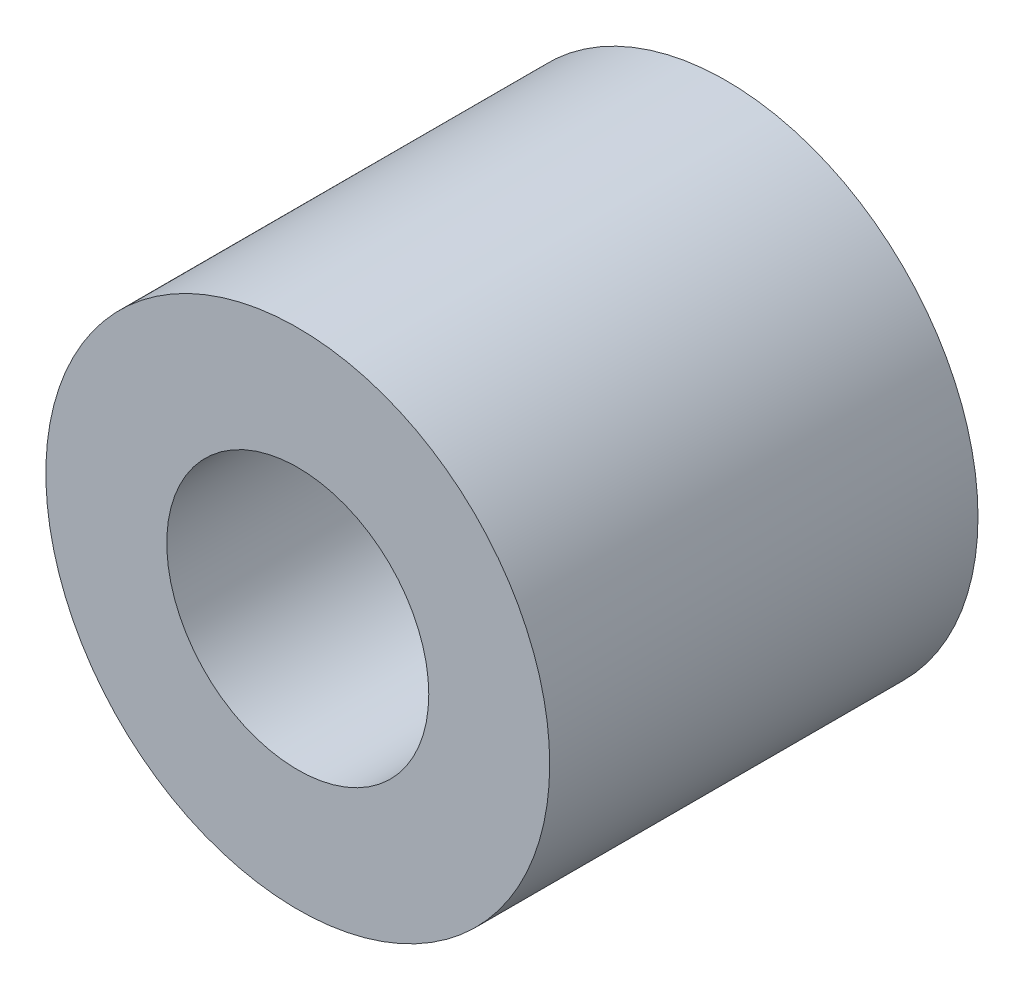
ISO-10303-21;
HEADER;
FILE_DESCRIPTION(('STEP AP214'),'2;1');
FILE_NAME('part.step','',(''),(''),'','','');
FILE_SCHEMA(('AUTOMOTIVE_DESIGN { 1 0 10303 214 1 1 1 1 }'));
ENDSEC;
DATA;
#1=APPLICATION_CONTEXT('core data for automotive mechanical design processes');
#2=APPLICATION_PROTOCOL_DEFINITION('international standard','automotive_design',2000,#1);
#3=PRODUCT_CONTEXT('',#1,'mechanical');
#4=PRODUCT('Part','Part','',(#3));
#5=PRODUCT_RELATED_PRODUCT_CATEGORY('part','',(#4));
#6=PRODUCT_DEFINITION_FORMATION('','',#4);
#7=PRODUCT_DEFINITION_CONTEXT('part definition',#1,'design');
#8=PRODUCT_DEFINITION('design','',#6,#7);
#9=PRODUCT_DEFINITION_SHAPE('','',#8);
#10=(LENGTH_UNIT() NAMED_UNIT(*) SI_UNIT(.MILLI.,.METRE.));
#11=(NAMED_UNIT(*) PLANE_ANGLE_UNIT() SI_UNIT($,.RADIAN.));
#12=(NAMED_UNIT(*) SI_UNIT($,.STERADIAN.) SOLID_ANGLE_UNIT());
#13=UNCERTAINTY_MEASURE_WITH_UNIT(LENGTH_MEASURE(1.E-05),#10,'distance_accuracy_value','');
#14=(GEOMETRIC_REPRESENTATION_CONTEXT(3) GLOBAL_UNCERTAINTY_ASSIGNED_CONTEXT((#13)) GLOBAL_UNIT_ASSIGNED_CONTEXT((#10,
#11,#12)) REPRESENTATION_CONTEXT('',''));
#15=CARTESIAN_POINT('',(0.,0.,0.));
#16=DIRECTION('',(0.,0.,1.));
#17=DIRECTION('',(1.,0.,0.));
#18=AXIS2_PLACEMENT_3D('',#15,#16,#17);
#19=CARTESIAN_POINT('',(0.,0.,8.5));
#20=DIRECTION('',(0.,0.,1.));
#21=DIRECTION('',(1.,0.,0.));
#22=AXIS2_PLACEMENT_3D('',#19,#20,#21);
#23=PLANE('',#22);
#24=CARTESIAN_POINT('',(0.,0.,8.5));
#25=DIRECTION('',(0.,0.,1.));
#26=DIRECTION('',(1.,0.,0.));
#27=AXIS2_PLACEMENT_3D('',#24,#25,#26);
#28=CIRCLE('',#27,5.);
#29=CARTESIAN_POINT('',(5.,0.,8.5));
#30=VERTEX_POINT('',#29);
#31=EDGE_CURVE('E10',#30,#30,#28,.T.);
#32=ORIENTED_EDGE('',*,*,#31,.T.);
#33=EDGE_LOOP('',(#32));
#34=FACE_BOUND('',#33,.T.);
#35=CARTESIAN_POINT('',(0.,0.,8.5));
#36=DIRECTION('',(0.,0.,1.));
#37=DIRECTION('',(1.,0.,0.));
#38=AXIS2_PLACEMENT_3D('',#35,#36,#37);
#39=CIRCLE('',#38,2.6);
#40=CARTESIAN_POINT('',(2.6,0.,8.5));
#41=VERTEX_POINT('',#40);
#42=EDGE_CURVE('E44',#41,#41,#39,.T.);
#43=ORIENTED_EDGE('',*,*,#42,.F.);
#44=EDGE_LOOP('',(#43));
#45=FACE_BOUND('',#44,.T.);
#46=ADVANCED_FACE('F33',(#34,#45),#23,.T.);
#47=CARTESIAN_POINT('',(0.,0.,0.));
#48=DIRECTION('',(0.,0.,1.));
#49=DIRECTION('',(1.,0.,0.));
#50=AXIS2_PLACEMENT_3D('',#47,#48,#49);
#51=PLANE('',#50);
#52=CARTESIAN_POINT('',(0.,0.,0.));
#53=DIRECTION('',(0.,0.,1.));
#54=DIRECTION('',(1.,0.,0.));
#55=AXIS2_PLACEMENT_3D('',#52,#53,#54);
#56=CIRCLE('',#55,5.);
#57=CARTESIAN_POINT('',(5.,0.,0.));
#58=VERTEX_POINT('',#57);
#59=EDGE_CURVE('E37',#58,#58,#56,.T.);
#60=ORIENTED_EDGE('',*,*,#59,.F.);
#61=EDGE_LOOP('',(#60));
#62=FACE_BOUND('',#61,.T.);
#63=CARTESIAN_POINT('',(0.,0.,0.));
#64=DIRECTION('',(0.,0.,1.));
#65=DIRECTION('',(1.,0.,0.));
#66=AXIS2_PLACEMENT_3D('',#63,#64,#65);
#67=CIRCLE('',#66,2.6);
#68=CARTESIAN_POINT('',(2.6,0.,0.));
#69=VERTEX_POINT('',#68);
#70=EDGE_CURVE('E46',#69,#69,#67,.T.);
#71=ORIENTED_EDGE('',*,*,#70,.T.);
#72=EDGE_LOOP('',(#71));
#73=FACE_BOUND('',#72,.T.);
#74=ADVANCED_FACE('F56',(#62,#73),#51,.F.);
#75=CARTESIAN_POINT('',(0.,0.,8.5));
#76=DIRECTION('',(0.,0.,-1.));
#77=DIRECTION('',(-1.,0.,0.));
#78=AXIS2_PLACEMENT_3D('',#75,#76,#77);
#79=CYLINDRICAL_SURFACE('',#78,5.);
#80=ORIENTED_EDGE('',*,*,#31,.F.);
#81=EDGE_LOOP('',(#80));
#82=FACE_BOUND('',#81,.T.);
#83=ORIENTED_EDGE('',*,*,#59,.T.);
#84=EDGE_LOOP('',(#83));
#85=FACE_BOUND('',#84,.T.);
#86=ADVANCED_FACE('F35',(#82,#85),#79,.T.);
#87=CARTESIAN_POINT('',(0.,0.,8.5));
#88=DIRECTION('',(0.,0.,-1.));
#89=DIRECTION('',(-1.,0.,0.));
#90=AXIS2_PLACEMENT_3D('',#87,#88,#89);
#91=CYLINDRICAL_SURFACE('',#90,2.6);
#92=ORIENTED_EDGE('',*,*,#42,.T.);
#93=EDGE_LOOP('',(#92));
#94=FACE_BOUND('',#93,.T.);
#95=ORIENTED_EDGE('',*,*,#70,.F.);
#96=EDGE_LOOP('',(#95));
#97=FACE_BOUND('',#96,.T.);
#98=ADVANCED_FACE('F52',(#94,#97),#91,.F.);
#99=CLOSED_SHELL('',(#46,#74,#86,#98));
#100=MANIFOLD_SOLID_BREP('B2',#99);
#101=ADVANCED_BREP_SHAPE_REPRESENTATION('',(#18,#100),#14);
#102=SHAPE_DEFINITION_REPRESENTATION(#9,#101);
ENDSEC;
END-ISO-10303-21;
